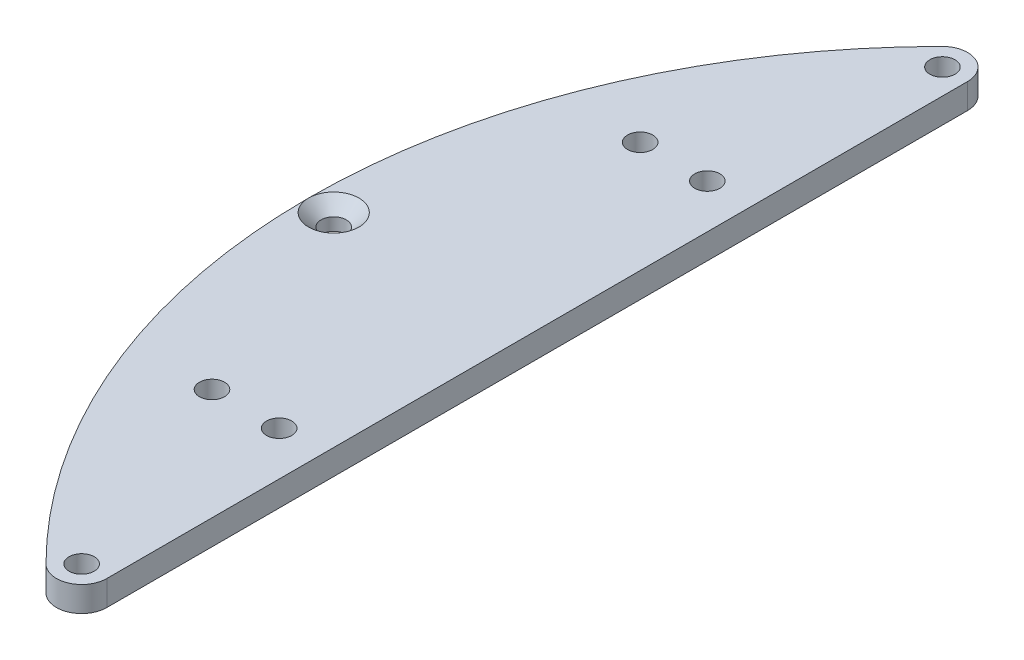
ISO-10303-21;
HEADER;
FILE_DESCRIPTION(('STEP AP214'),'2;1');
FILE_NAME('part.step','',(''),(''),'','','');
FILE_SCHEMA(('AUTOMOTIVE_DESIGN { 1 0 10303 214 1 1 1 1 }'));
ENDSEC;
DATA;
#1=APPLICATION_CONTEXT('core data for automotive mechanical design processes');
#2=APPLICATION_PROTOCOL_DEFINITION('international standard','automotive_design',2000,#1);
#3=PRODUCT_CONTEXT('',#1,'mechanical');
#4=PRODUCT('Part','Part','',(#3));
#5=PRODUCT_RELATED_PRODUCT_CATEGORY('part','',(#4));
#6=PRODUCT_DEFINITION_FORMATION('','',#4);
#7=PRODUCT_DEFINITION_CONTEXT('part definition',#1,'design');
#8=PRODUCT_DEFINITION('design','',#6,#7);
#9=PRODUCT_DEFINITION_SHAPE('','',#8);
#10=(LENGTH_UNIT() NAMED_UNIT(*) SI_UNIT(.MILLI.,.METRE.));
#11=(NAMED_UNIT(*) PLANE_ANGLE_UNIT() SI_UNIT($,.RADIAN.));
#12=(NAMED_UNIT(*) SI_UNIT($,.STERADIAN.) SOLID_ANGLE_UNIT());
#13=UNCERTAINTY_MEASURE_WITH_UNIT(LENGTH_MEASURE(1.E-05),#10,'distance_accuracy_value','');
#14=(GEOMETRIC_REPRESENTATION_CONTEXT(3) GLOBAL_UNCERTAINTY_ASSIGNED_CONTEXT((#13)) GLOBAL_UNIT_ASSIGNED_CONTEXT((#10,
#11,#12)) REPRESENTATION_CONTEXT('',''));
#15=CARTESIAN_POINT('',(0.,0.,0.));
#16=DIRECTION('',(0.,0.,1.));
#17=DIRECTION('',(1.,0.,0.));
#18=AXIS2_PLACEMENT_3D('',#15,#16,#17);
#19=CARTESIAN_POINT('',(-51.2652416360247,3.,51.2652416360247));
#20=DIRECTION('',(0.,-1.,0.));
#21=DIRECTION('',(0.,0.,-1.));
#22=AXIS2_PLACEMENT_3D('',#19,#20,#21);
#23=CYLINDRICAL_SURFACE('',#22,2.99999999999996);
#24=CARTESIAN_POINT('',(-51.2652416360247,0.,51.2652416360247));
#25=DIRECTION('',(0.,1.,0.));
#26=DIRECTION('',(0.,0.,1.));
#27=AXIS2_PLACEMENT_3D('',#24,#25,#26);
#28=CIRCLE('',#27,2.99999999999996);
#29=CARTESIAN_POINT('',(-48.2652416360247,0.,51.2652416360247));
#30=VERTEX_POINT('',#29);
#31=CARTESIAN_POINT('',(-53.3865619795843,0.,53.3865619795843));
#32=VERTEX_POINT('',#31);
#33=EDGE_CURVE('E132',#30,#32,#28,.F.);
#34=ORIENTED_EDGE('',*,*,#33,.F.);
#35=DIRECTION('',(0.,-1.,0.));
#36=VECTOR('',#35,1.);
#37=CARTESIAN_POINT('',(-48.2652416360247,3.,51.2652416360247));
#38=LINE('',#37,#36);
#39=CARTESIAN_POINT('',(-48.2652416360247,3.,51.2652416360247));
#40=VERTEX_POINT('',#39);
#41=EDGE_CURVE('E80',#40,#30,#38,.T.);
#42=ORIENTED_EDGE('',*,*,#41,.F.);
#43=CARTESIAN_POINT('',(-51.2652416360247,3.,51.2652416360247));
#44=DIRECTION('',(0.,1.,0.));
#45=DIRECTION('',(0.,0.,1.));
#46=AXIS2_PLACEMENT_3D('',#43,#44,#45);
#47=CIRCLE('',#46,2.99999999999996);
#48=CARTESIAN_POINT('',(-53.3865619795843,3.,53.3865619795843));
#49=VERTEX_POINT('',#48);
#50=EDGE_CURVE('E106',#40,#49,#47,.F.);
#51=ORIENTED_EDGE('',*,*,#50,.T.);
#52=DIRECTION('',(0.,-1.,0.));
#53=VECTOR('',#52,1.);
#54=CARTESIAN_POINT('',(-53.3865619795843,3.,53.3865619795843));
#55=LINE('',#54,#53);
#56=EDGE_CURVE('E76',#49,#32,#55,.T.);
#57=ORIENTED_EDGE('',*,*,#56,.T.);
#58=EDGE_LOOP('',(#34,#42,#51,#57));
#59=FACE_BOUND('',#58,.T.);
#60=ADVANCED_FACE('F37',(#59),#23,.T.);
#61=CARTESIAN_POINT('',(-48.2652416360247,3.,0.));
#62=DIRECTION('',(1.,0.,0.));
#63=DIRECTION('',(0.,0.,-1.));
#64=AXIS2_PLACEMENT_3D('',#61,#62,#63);
#65=PLANE('',#64);
#66=DIRECTION('',(0.,0.,1.));
#67=VECTOR('',#66,1.);
#68=CARTESIAN_POINT('',(-48.2652416360247,0.,0.));
#69=LINE('',#68,#67);
#70=CARTESIAN_POINT('',(-48.2652416360247,0.,-51.2652416360247));
#71=VERTEX_POINT('',#70);
#72=EDGE_CURVE('E91',#71,#30,#69,.T.);
#73=ORIENTED_EDGE('',*,*,#72,.F.);
#74=DIRECTION('',(0.,-1.,0.));
#75=VECTOR('',#74,1.);
#76=CARTESIAN_POINT('',(-48.2652416360247,3.,-51.2652416360247));
#77=LINE('',#76,#75);
#78=CARTESIAN_POINT('',(-48.2652416360247,3.,-51.2652416360247));
#79=VERTEX_POINT('',#78);
#80=EDGE_CURVE('E85',#79,#71,#77,.T.);
#81=ORIENTED_EDGE('',*,*,#80,.F.);
#82=DIRECTION('',(0.,0.,1.));
#83=VECTOR('',#82,1.);
#84=CARTESIAN_POINT('',(-48.2652416360247,3.,0.));
#85=LINE('',#84,#83);
#86=EDGE_CURVE('E89',#79,#40,#85,.T.);
#87=ORIENTED_EDGE('',*,*,#86,.T.);
#88=ORIENTED_EDGE('',*,*,#41,.T.);
#89=EDGE_LOOP('',(#73,#81,#87,#88));
#90=FACE_BOUND('',#89,.T.);
#91=ADVANCED_FACE('F87',(#90),#65,.T.);
#92=CARTESIAN_POINT('',(-51.2652416360247,3.,-51.2652416360247));
#93=DIRECTION('',(0.,-1.,0.));
#94=DIRECTION('',(0.,0.,-1.));
#95=AXIS2_PLACEMENT_3D('',#92,#93,#94);
#96=CYLINDRICAL_SURFACE('',#95,3.00000000000001);
#97=CARTESIAN_POINT('',(-51.2652416360247,0.,-51.2652416360247));
#98=DIRECTION('',(0.,1.,0.));
#99=DIRECTION('',(0.,0.,1.));
#100=AXIS2_PLACEMENT_3D('',#97,#98,#99);
#101=CIRCLE('',#100,3.00000000000001);
#102=CARTESIAN_POINT('',(-53.3865619795843,0.,-53.3865619795843));
#103=VERTEX_POINT('',#102);
#104=EDGE_CURVE('E136',#71,#103,#101,.T.);
#105=ORIENTED_EDGE('',*,*,#104,.T.);
#106=DIRECTION('',(0.,-1.,0.));
#107=VECTOR('',#106,1.);
#108=CARTESIAN_POINT('',(-53.3865619795843,3.,-53.3865619795843));
#109=LINE('',#108,#107);
#110=CARTESIAN_POINT('',(-53.3865619795843,3.,-53.3865619795843));
#111=VERTEX_POINT('',#110);
#112=EDGE_CURVE('E95',#111,#103,#109,.T.);
#113=ORIENTED_EDGE('',*,*,#112,.F.);
#114=CARTESIAN_POINT('',(-51.2652416360247,3.,-51.2652416360247));
#115=DIRECTION('',(0.,1.,0.));
#116=DIRECTION('',(0.,0.,1.));
#117=AXIS2_PLACEMENT_3D('',#114,#115,#116);
#118=CIRCLE('',#117,3.00000000000001);
#119=EDGE_CURVE('E99',#79,#111,#118,.T.);
#120=ORIENTED_EDGE('',*,*,#119,.F.);
#121=ORIENTED_EDGE('',*,*,#80,.T.);
#122=EDGE_LOOP('',(#105,#113,#120,#121));
#123=FACE_BOUND('',#122,.T.);
#124=ADVANCED_FACE('F100',(#123),#96,.T.);
#125=CARTESIAN_POINT('',(-72.5,3.,0.));
#126=DIRECTION('',(0.,-1.,0.));
#127=DIRECTION('',(0.,0.,-1.));
#128=AXIS2_PLACEMENT_3D('',#125,#126,#127);
#129=CYLINDRICAL_SURFACE('',#128,1.5);
#130=CARTESIAN_POINT('',(-72.5,1.49999999999999,0.));
#131=DIRECTION('',(0.,1.,0.));
#132=DIRECTION('',(0.,0.,1.));
#133=AXIS2_PLACEMENT_3D('',#130,#131,#132);
#134=CIRCLE('',#133,1.5);
#135=CARTESIAN_POINT('',(-72.5,1.49999999999999,1.50000000000001));
#136=VERTEX_POINT('',#135);
#137=EDGE_CURVE('E45',#136,#136,#134,.T.);
#138=ORIENTED_EDGE('',*,*,#137,.T.);
#139=EDGE_LOOP('',(#138));
#140=FACE_BOUND('',#139,.T.);
#141=CARTESIAN_POINT('',(-72.5,0.,0.));
#142=DIRECTION('',(0.,1.,0.));
#143=DIRECTION('',(0.,0.,1.));
#144=AXIS2_PLACEMENT_3D('',#141,#142,#143);
#145=CIRCLE('',#144,1.5);
#146=CARTESIAN_POINT('',(-72.5,0.,1.50000000000001));
#147=VERTEX_POINT('',#146);
#148=EDGE_CURVE('E143',#147,#147,#145,.T.);
#149=ORIENTED_EDGE('',*,*,#148,.F.);
#150=EDGE_LOOP('',(#149));
#151=FACE_BOUND('',#150,.T.);
#152=ADVANCED_FACE('F155',(#140,#151),#129,.F.);
#153=CARTESIAN_POINT('',(-51.2652416360247,3.,-51.2652416360247));
#154=DIRECTION('',(0.,-1.,0.));
#155=DIRECTION('',(0.,0.,-1.));
#156=AXIS2_PLACEMENT_3D('',#153,#154,#155);
#157=CYLINDRICAL_SURFACE('',#156,1.50000000000001);
#158=CARTESIAN_POINT('',(-51.2652416360247,3.,-51.2652416360247));
#159=DIRECTION('',(0.,1.,0.));
#160=DIRECTION('',(0.,0.,1.));
#161=AXIS2_PLACEMENT_3D('',#158,#159,#160);
#162=CIRCLE('',#161,1.50000000000001);
#163=CARTESIAN_POINT('',(-51.2652416360247,3.,-49.7652416360247));
#164=VERTEX_POINT('',#163);
#165=EDGE_CURVE('E114',#164,#164,#162,.T.);
#166=ORIENTED_EDGE('',*,*,#165,.T.);
#167=EDGE_LOOP('',(#166));
#168=FACE_BOUND('',#167,.T.);
#169=CARTESIAN_POINT('',(-51.2652416360247,0.,-51.2652416360247));
#170=DIRECTION('',(0.,1.,0.));
#171=DIRECTION('',(0.,0.,1.));
#172=AXIS2_PLACEMENT_3D('',#169,#170,#171);
#173=CIRCLE('',#172,1.50000000000001);
#174=CARTESIAN_POINT('',(-51.2652416360247,0.,-49.7652416360247));
#175=VERTEX_POINT('',#174);
#176=EDGE_CURVE('E140',#175,#175,#173,.T.);
#177=ORIENTED_EDGE('',*,*,#176,.F.);
#178=EDGE_LOOP('',(#177));
#179=FACE_BOUND('',#178,.T.);
#180=ADVANCED_FACE('F213',(#168,#179),#157,.F.);
#181=CARTESIAN_POINT('',(0.,3.,0.));
#182=DIRECTION('',(0.,-1.,0.));
#183=DIRECTION('',(0.,0.,-1.));
#184=AXIS2_PLACEMENT_3D('',#181,#182,#183);
#185=CYLINDRICAL_SURFACE('',#184,75.5);
#186=CARTESIAN_POINT('',(0.,0.,0.));
#187=DIRECTION('',(0.,1.,0.));
#188=DIRECTION('',(0.,0.,1.));
#189=AXIS2_PLACEMENT_3D('',#186,#187,#188);
#190=CIRCLE('',#189,75.5);
#191=EDGE_CURVE('E138',#103,#32,#190,.T.);
#192=ORIENTED_EDGE('',*,*,#191,.T.);
#193=ORIENTED_EDGE('',*,*,#56,.F.);
#194=CARTESIAN_POINT('',(0.,3.,0.));
#195=DIRECTION('',(0.,1.,0.));
#196=DIRECTION('',(0.,0.,1.));
#197=AXIS2_PLACEMENT_3D('',#194,#195,#196);
#198=CIRCLE('',#197,75.5);
#199=CARTESIAN_POINT('',(-75.5,3.,0.));
#200=VERTEX_POINT('',#199);
#201=EDGE_CURVE('E55',#200,#49,#198,.T.);
#202=ORIENTED_EDGE('',*,*,#201,.F.);
#203=EDGE_CURVE('E112',#111,#200,#198,.T.);
#204=ORIENTED_EDGE('',*,*,#203,.F.);
#205=ORIENTED_EDGE('',*,*,#112,.T.);
#206=EDGE_LOOP('',(#192,#193,#202,#204,#205));
#207=FACE_BOUND('',#206,.T.);
#208=ADVANCED_FACE('F177',(#207),#185,.T.);
#209=CARTESIAN_POINT('',(-61.499999083872,3.,25.5));
#210=DIRECTION('',(0.,-1.,0.));
#211=DIRECTION('',(0.,0.,-1.));
#212=AXIS2_PLACEMENT_3D('',#209,#210,#211);
#213=CYLINDRICAL_SURFACE('',#212,1.49999999999996);
#214=CARTESIAN_POINT('',(-61.499999083872,3.,25.5));
#215=DIRECTION('',(0.,1.,0.));
#216=DIRECTION('',(0.,0.,1.));
#217=AXIS2_PLACEMENT_3D('',#214,#215,#216);
#218=CIRCLE('',#217,1.49999999999996);
#219=CARTESIAN_POINT('',(-61.499999083872,3.,26.9999999999999));
#220=VERTEX_POINT('',#219);
#221=EDGE_CURVE('E108',#220,#220,#218,.T.);
#222=ORIENTED_EDGE('',*,*,#221,.T.);
#223=EDGE_LOOP('',(#222));
#224=FACE_BOUND('',#223,.T.);
#225=CARTESIAN_POINT('',(-61.499999083872,0.,25.5));
#226=DIRECTION('',(0.,1.,0.));
#227=DIRECTION('',(0.,0.,1.));
#228=AXIS2_PLACEMENT_3D('',#225,#226,#227);
#229=CIRCLE('',#228,1.49999999999996);
#230=CARTESIAN_POINT('',(-61.499999083872,0.,26.9999999999999));
#231=VERTEX_POINT('',#230);
#232=EDGE_CURVE('E129',#231,#231,#229,.T.);
#233=ORIENTED_EDGE('',*,*,#232,.F.);
#234=EDGE_LOOP('',(#233));
#235=FACE_BOUND('',#234,.T.);
#236=ADVANCED_FACE('F173',(#224,#235),#213,.F.);
#237=CARTESIAN_POINT('',(-53.499999083872,3.,25.4999999999999));
#238=DIRECTION('',(0.,-1.,0.));
#239=DIRECTION('',(0.,0.,-1.));
#240=AXIS2_PLACEMENT_3D('',#237,#238,#239);
#241=CYLINDRICAL_SURFACE('',#240,1.49999999999995);
#242=CARTESIAN_POINT('',(-53.499999083872,3.,25.4999999999999));
#243=DIRECTION('',(0.,1.,0.));
#244=DIRECTION('',(0.,0.,1.));
#245=AXIS2_PLACEMENT_3D('',#242,#243,#244);
#246=CIRCLE('',#245,1.49999999999995);
#247=CARTESIAN_POINT('',(-53.499999083872,3.,26.9999999999999));
#248=VERTEX_POINT('',#247);
#249=EDGE_CURVE('E311',#248,#248,#246,.T.);
#250=ORIENTED_EDGE('',*,*,#249,.T.);
#251=EDGE_LOOP('',(#250));
#252=FACE_BOUND('',#251,.T.);
#253=CARTESIAN_POINT('',(-53.499999083872,0.,25.4999999999999));
#254=DIRECTION('',(0.,1.,0.));
#255=DIRECTION('',(0.,0.,1.));
#256=AXIS2_PLACEMENT_3D('',#253,#254,#255);
#257=CIRCLE('',#256,1.49999999999995);
#258=CARTESIAN_POINT('',(-53.499999083872,0.,26.9999999999999));
#259=VERTEX_POINT('',#258);
#260=EDGE_CURVE('E126',#259,#259,#257,.T.);
#261=ORIENTED_EDGE('',*,*,#260,.F.);
#262=EDGE_LOOP('',(#261));
#263=FACE_BOUND('',#262,.T.);
#264=ADVANCED_FACE('F176',(#252,#263),#241,.F.);
#265=CARTESIAN_POINT('',(-61.499999083872,3.,-25.5000000000001));
#266=DIRECTION('',(0.,-1.,0.));
#267=DIRECTION('',(0.,0.,-1.));
#268=AXIS2_PLACEMENT_3D('',#265,#266,#267);
#269=CYLINDRICAL_SURFACE('',#268,1.49999999999996);
#270=CARTESIAN_POINT('',(-61.499999083872,3.,-25.5000000000001));
#271=DIRECTION('',(0.,1.,0.));
#272=DIRECTION('',(0.,0.,1.));
#273=AXIS2_PLACEMENT_3D('',#270,#271,#272);
#274=CIRCLE('',#273,1.49999999999996);
#275=CARTESIAN_POINT('',(-61.499999083872,3.,-24.0000000000001));
#276=VERTEX_POINT('',#275);
#277=EDGE_CURVE('E307',#276,#276,#274,.T.);
#278=ORIENTED_EDGE('',*,*,#277,.T.);
#279=EDGE_LOOP('',(#278));
#280=FACE_BOUND('',#279,.T.);
#281=CARTESIAN_POINT('',(-61.499999083872,0.,-25.5000000000001));
#282=DIRECTION('',(0.,1.,0.));
#283=DIRECTION('',(0.,0.,1.));
#284=AXIS2_PLACEMENT_3D('',#281,#282,#283);
#285=CIRCLE('',#284,1.49999999999996);
#286=CARTESIAN_POINT('',(-61.499999083872,0.,-24.0000000000001));
#287=VERTEX_POINT('',#286);
#288=EDGE_CURVE('E123',#287,#287,#285,.T.);
#289=ORIENTED_EDGE('',*,*,#288,.F.);
#290=EDGE_LOOP('',(#289));
#291=FACE_BOUND('',#290,.T.);
#292=ADVANCED_FACE('F181',(#280,#291),#269,.F.);
#293=CARTESIAN_POINT('',(-53.499999083872,3.,-25.5000000000001));
#294=DIRECTION('',(0.,-1.,0.));
#295=DIRECTION('',(0.,0.,-1.));
#296=AXIS2_PLACEMENT_3D('',#293,#294,#295);
#297=CYLINDRICAL_SURFACE('',#296,1.49999999999996);
#298=CARTESIAN_POINT('',(-53.499999083872,3.,-25.5000000000001));
#299=DIRECTION('',(0.,1.,0.));
#300=DIRECTION('',(0.,0.,1.));
#301=AXIS2_PLACEMENT_3D('',#298,#299,#300);
#302=CIRCLE('',#301,1.49999999999996);
#303=CARTESIAN_POINT('',(-53.499999083872,3.,-24.0000000000001));
#304=VERTEX_POINT('',#303);
#305=EDGE_CURVE('E149',#304,#304,#302,.T.);
#306=ORIENTED_EDGE('',*,*,#305,.T.);
#307=EDGE_LOOP('',(#306));
#308=FACE_BOUND('',#307,.T.);
#309=CARTESIAN_POINT('',(-53.499999083872,0.,-25.5000000000001));
#310=DIRECTION('',(0.,1.,0.));
#311=DIRECTION('',(0.,0.,1.));
#312=AXIS2_PLACEMENT_3D('',#309,#310,#311);
#313=CIRCLE('',#312,1.49999999999996);
#314=CARTESIAN_POINT('',(-53.499999083872,0.,-24.0000000000001));
#315=VERTEX_POINT('',#314);
#316=EDGE_CURVE('E120',#315,#315,#313,.T.);
#317=ORIENTED_EDGE('',*,*,#316,.F.);
#318=EDGE_LOOP('',(#317));
#319=FACE_BOUND('',#318,.T.);
#320=ADVANCED_FACE('F184',(#308,#319),#297,.F.);
#321=CARTESIAN_POINT('',(-51.2652416360247,3.,51.2652416360247));
#322=DIRECTION('',(0.,-1.,0.));
#323=DIRECTION('',(0.,0.,-1.));
#324=AXIS2_PLACEMENT_3D('',#321,#322,#323);
#325=CYLINDRICAL_SURFACE('',#324,1.5);
#326=CARTESIAN_POINT('',(-51.2652416360247,3.,51.2652416360247));
#327=DIRECTION('',(0.,1.,0.));
#328=DIRECTION('',(0.,0.,1.));
#329=AXIS2_PLACEMENT_3D('',#326,#327,#328);
#330=CIRCLE('',#329,1.5);
#331=CARTESIAN_POINT('',(-51.2652416360247,3.,52.7652416360247));
#332=VERTEX_POINT('',#331);
#333=EDGE_CURVE('E117',#332,#332,#330,.T.);
#334=ORIENTED_EDGE('',*,*,#333,.T.);
#335=EDGE_LOOP('',(#334));
#336=FACE_BOUND('',#335,.T.);
#337=CARTESIAN_POINT('',(-51.2652416360247,0.,51.2652416360247));
#338=DIRECTION('',(0.,1.,0.));
#339=DIRECTION('',(0.,0.,1.));
#340=AXIS2_PLACEMENT_3D('',#337,#338,#339);
#341=CIRCLE('',#340,1.5);
#342=CARTESIAN_POINT('',(-51.2652416360247,0.,52.7652416360247));
#343=VERTEX_POINT('',#342);
#344=EDGE_CURVE('E146',#343,#343,#341,.T.);
#345=ORIENTED_EDGE('',*,*,#344,.F.);
#346=EDGE_LOOP('',(#345));
#347=FACE_BOUND('',#346,.T.);
#348=ADVANCED_FACE('F187',(#336,#347),#325,.F.);
#349=CARTESIAN_POINT('',(0.,3.,0.));
#350=DIRECTION('',(0.,1.,0.));
#351=DIRECTION('',(0.,0.,1.));
#352=AXIS2_PLACEMENT_3D('',#349,#350,#351);
#353=PLANE('',#352);
#354=ORIENTED_EDGE('',*,*,#305,.F.);
#355=EDGE_LOOP('',(#354));
#356=FACE_BOUND('',#355,.T.);
#357=ORIENTED_EDGE('',*,*,#277,.F.);
#358=EDGE_LOOP('',(#357));
#359=FACE_BOUND('',#358,.T.);
#360=ORIENTED_EDGE('',*,*,#249,.F.);
#361=EDGE_LOOP('',(#360));
#362=FACE_BOUND('',#361,.T.);
#363=ORIENTED_EDGE('',*,*,#221,.F.);
#364=EDGE_LOOP('',(#363));
#365=FACE_BOUND('',#364,.T.);
#366=ORIENTED_EDGE('',*,*,#203,.T.);
#367=CARTESIAN_POINT('',(-72.5,3.,0.));
#368=DIRECTION('',(0.,1.,0.));
#369=DIRECTION('',(0.,0.,1.));
#370=AXIS2_PLACEMENT_3D('',#367,#368,#369);
#371=CIRCLE('',#370,3.00000000000003);
#372=EDGE_CURVE('E11',#200,#200,#371,.F.);
#373=ORIENTED_EDGE('',*,*,#372,.T.);
#374=ORIENTED_EDGE('',*,*,#201,.T.);
#375=ORIENTED_EDGE('',*,*,#50,.F.);
#376=ORIENTED_EDGE('',*,*,#86,.F.);
#377=ORIENTED_EDGE('',*,*,#119,.T.);
#378=EDGE_LOOP('',(#366,#373,#374,#375,#376,#377));
#379=FACE_BOUND('',#378,.T.);
#380=ORIENTED_EDGE('',*,*,#165,.F.);
#381=EDGE_LOOP('',(#380));
#382=FACE_BOUND('',#381,.T.);
#383=ORIENTED_EDGE('',*,*,#333,.F.);
#384=EDGE_LOOP('',(#383));
#385=FACE_BOUND('',#384,.T.);
#386=ADVANCED_FACE('F104',(#356,#359,#362,#365,#379,#382,#385),#353,.T.);
#387=CARTESIAN_POINT('',(0.,0.,0.));
#388=DIRECTION('',(0.,1.,0.));
#389=DIRECTION('',(0.,0.,1.));
#390=AXIS2_PLACEMENT_3D('',#387,#388,#389);
#391=PLANE('',#390);
#392=ORIENTED_EDGE('',*,*,#316,.T.);
#393=EDGE_LOOP('',(#392));
#394=FACE_BOUND('',#393,.T.);
#395=ORIENTED_EDGE('',*,*,#288,.T.);
#396=EDGE_LOOP('',(#395));
#397=FACE_BOUND('',#396,.T.);
#398=ORIENTED_EDGE('',*,*,#260,.T.);
#399=EDGE_LOOP('',(#398));
#400=FACE_BOUND('',#399,.T.);
#401=ORIENTED_EDGE('',*,*,#232,.T.);
#402=EDGE_LOOP('',(#401));
#403=FACE_BOUND('',#402,.T.);
#404=ORIENTED_EDGE('',*,*,#33,.T.);
#405=ORIENTED_EDGE('',*,*,#191,.F.);
#406=ORIENTED_EDGE('',*,*,#104,.F.);
#407=ORIENTED_EDGE('',*,*,#72,.T.);
#408=EDGE_LOOP('',(#404,#405,#406,#407));
#409=FACE_BOUND('',#408,.T.);
#410=ORIENTED_EDGE('',*,*,#176,.T.);
#411=EDGE_LOOP('',(#410));
#412=FACE_BOUND('',#411,.T.);
#413=ORIENTED_EDGE('',*,*,#148,.T.);
#414=EDGE_LOOP('',(#413));
#415=FACE_BOUND('',#414,.T.);
#416=ORIENTED_EDGE('',*,*,#344,.T.);
#417=EDGE_LOOP('',(#416));
#418=FACE_BOUND('',#417,.T.);
#419=ADVANCED_FACE('F159',(#394,#397,#400,#403,#409,#412,#415,#418),#391,.F.);
#420=CARTESIAN_POINT('',(-72.5,1.49999999999999,0.));
#421=DIRECTION('',(0.,1.,0.));
#422=DIRECTION('',(0.,0.,1.));
#423=AXIS2_PLACEMENT_3D('',#420,#421,#422);
#424=CONICAL_SURFACE('',#423,1.5,0.785398163397456);
#425=ORIENTED_EDGE('',*,*,#372,.F.);
#426=EDGE_LOOP('',(#425));
#427=FACE_BOUND('',#426,.T.);
#428=ORIENTED_EDGE('',*,*,#137,.F.);
#429=EDGE_LOOP('',(#428));
#430=FACE_BOUND('',#429,.T.);
#431=ADVANCED_FACE('F39',(#427,#430),#424,.F.);
#432=CLOSED_SHELL('',(#60,#91,#124,#152,#180,#208,#236,#264,#292,#320,#348,#386,#419,#431));
#433=MANIFOLD_SOLID_BREP('B2',#432);
#434=ADVANCED_BREP_SHAPE_REPRESENTATION('',(#18,#433),#14);
#435=SHAPE_DEFINITION_REPRESENTATION(#9,#434);
ENDSEC;
END-ISO-10303-21;
